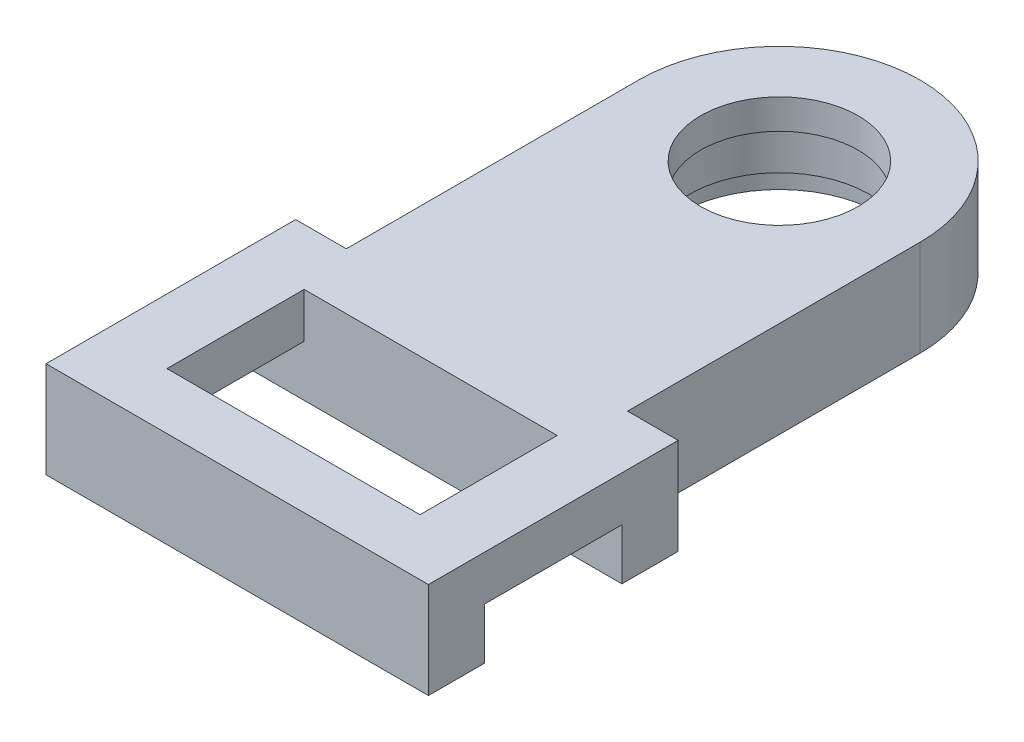
ISO-10303-21;
HEADER;
FILE_DESCRIPTION(('STEP AP214'),'2;1');
FILE_NAME('part.step','',(''),(''),'','','');
FILE_SCHEMA(('AUTOMOTIVE_DESIGN { 1 0 10303 214 1 1 1 1 }'));
ENDSEC;
DATA;
#1=APPLICATION_CONTEXT('core data for automotive mechanical design processes');
#2=APPLICATION_PROTOCOL_DEFINITION('international standard','automotive_design',2000,#1);
#3=PRODUCT_CONTEXT('',#1,'mechanical');
#4=PRODUCT('Part','Part','',(#3));
#5=PRODUCT_RELATED_PRODUCT_CATEGORY('part','',(#4));
#6=PRODUCT_DEFINITION_FORMATION('','',#4);
#7=PRODUCT_DEFINITION_CONTEXT('part definition',#1,'design');
#8=PRODUCT_DEFINITION('design','',#6,#7);
#9=PRODUCT_DEFINITION_SHAPE('','',#8);
#10=(LENGTH_UNIT() NAMED_UNIT(*) SI_UNIT(.MILLI.,.METRE.));
#11=(NAMED_UNIT(*) PLANE_ANGLE_UNIT() SI_UNIT($,.RADIAN.));
#12=(NAMED_UNIT(*) SI_UNIT($,.STERADIAN.) SOLID_ANGLE_UNIT());
#13=UNCERTAINTY_MEASURE_WITH_UNIT(LENGTH_MEASURE(1.E-05),#10,'distance_accuracy_value','');
#14=(GEOMETRIC_REPRESENTATION_CONTEXT(3) GLOBAL_UNCERTAINTY_ASSIGNED_CONTEXT((#13)) GLOBAL_UNIT_ASSIGNED_CONTEXT((#10,
#11,#12)) REPRESENTATION_CONTEXT('',''));
#15=CARTESIAN_POINT('',(0.,0.,0.));
#16=DIRECTION('',(0.,0.,1.));
#17=DIRECTION('',(1.,0.,0.));
#18=AXIS2_PLACEMENT_3D('',#15,#16,#17);
#19=CARTESIAN_POINT('',(0.,0.,-37.1));
#20=DIRECTION('',(0.,1.,0.));
#21=DIRECTION('',(0.,0.,1.));
#22=AXIS2_PLACEMENT_3D('',#19,#20,#21);
#23=CYLINDRICAL_SURFACE('',#22,8.);
#24=CARTESIAN_POINT('',(0.,-2.55,-37.1));
#25=DIRECTION('',(0.,-1.,0.));
#26=DIRECTION('',(0.,0.,-1.));
#27=AXIS2_PLACEMENT_3D('',#24,#25,#26);
#28=CIRCLE('',#27,8.);
#29=CARTESIAN_POINT('',(0.,-2.55,-45.1));
#30=VERTEX_POINT('',#29);
#31=EDGE_CURVE('E223',#30,#30,#28,.T.);
#32=ORIENTED_EDGE('',*,*,#31,.T.);
#33=EDGE_LOOP('',(#32));
#34=FACE_BOUND('',#33,.T.);
#35=CARTESIAN_POINT('',(0.,1.35,-37.1));
#36=DIRECTION('',(0.,1.,0.));
#37=DIRECTION('',(0.,0.,1.));
#38=AXIS2_PLACEMENT_3D('',#35,#36,#37);
#39=CIRCLE('',#38,8.);
#40=CARTESIAN_POINT('',(0.,1.35,-29.1));
#41=VERTEX_POINT('',#40);
#42=EDGE_CURVE('E11',#41,#41,#39,.F.);
#43=ORIENTED_EDGE('',*,*,#42,.F.);
#44=EDGE_LOOP('',(#43));
#45=FACE_BOUND('',#44,.T.);
#46=ADVANCED_FACE('F41',(#34,#45),#23,.F.);
#47=CARTESIAN_POINT('',(0.,0.,0.));
#48=DIRECTION('',(0.,-1.,0.));
#49=DIRECTION('',(0.,0.,-1.));
#50=AXIS2_PLACEMENT_3D('',#47,#48,#49);
#51=PLANE('',#50);
#52=DIRECTION('',(0.,0.,-1.));
#53=VECTOR('',#52,1.);
#54=CARTESIAN_POINT('',(17.,0.,11.1));
#55=LINE('',#54,#53);
#56=CARTESIAN_POINT('',(17.,0.,6.1));
#57=VERTEX_POINT('',#56);
#58=CARTESIAN_POINT('',(17.,0.,-6.1));
#59=VERTEX_POINT('',#58);
#60=EDGE_CURVE('E56',#57,#59,#55,.T.);
#61=ORIENTED_EDGE('',*,*,#60,.F.);
#62=DIRECTION('',(1.,0.,0.));
#63=VECTOR('',#62,1.);
#64=CARTESIAN_POINT('',(0.,0.,6.1));
#65=LINE('',#64,#63);
#66=CARTESIAN_POINT('',(11.25,0.,6.1));
#67=VERTEX_POINT('',#66);
#68=EDGE_CURVE('E179',#67,#57,#65,.T.);
#69=ORIENTED_EDGE('',*,*,#68,.F.);
#70=DIRECTION('',(0.,0.,-1.));
#71=VECTOR('',#70,1.);
#72=CARTESIAN_POINT('',(11.25,0.,6.1));
#73=LINE('',#72,#71);
#74=CARTESIAN_POINT('',(11.25,0.,-6.1));
#75=VERTEX_POINT('',#74);
#76=EDGE_CURVE('E238',#67,#75,#73,.T.);
#77=ORIENTED_EDGE('',*,*,#76,.T.);
#78=DIRECTION('',(1.,0.,0.));
#79=VECTOR('',#78,1.);
#80=CARTESIAN_POINT('',(0.,0.,-6.1));
#81=LINE('',#80,#79);
#82=EDGE_CURVE('E215',#75,#59,#81,.T.);
#83=ORIENTED_EDGE('',*,*,#82,.T.);
#84=EDGE_LOOP('',(#61,#69,#77,#83));
#85=FACE_BOUND('',#84,.T.);
#86=ADVANCED_FACE('F355',(#85),#51,.T.);
#87=DIRECTION('',(0.,0.,1.));
#88=VECTOR('',#87,1.);
#89=CARTESIAN_POINT('',(-11.25,0.,6.1));
#90=LINE('',#89,#88);
#91=CARTESIAN_POINT('',(-11.25,0.,-6.1));
#92=VERTEX_POINT('',#91);
#93=CARTESIAN_POINT('',(-11.25,0.,6.1));
#94=VERTEX_POINT('',#93);
#95=EDGE_CURVE('E248',#92,#94,#90,.T.);
#96=ORIENTED_EDGE('',*,*,#95,.T.);
#97=CARTESIAN_POINT('',(-17.,0.,6.1));
#98=VERTEX_POINT('',#97);
#99=EDGE_CURVE('E64',#98,#94,#65,.T.);
#100=ORIENTED_EDGE('',*,*,#99,.F.);
#101=DIRECTION('',(0.,0.,1.));
#102=VECTOR('',#101,1.);
#103=CARTESIAN_POINT('',(-17.,0.,11.1));
#104=LINE('',#103,#102);
#105=CARTESIAN_POINT('',(-17.,0.,-6.1));
#106=VERTEX_POINT('',#105);
#107=EDGE_CURVE('E173',#106,#98,#104,.T.);
#108=ORIENTED_EDGE('',*,*,#107,.F.);
#109=EDGE_CURVE('E190',#106,#92,#81,.T.);
#110=ORIENTED_EDGE('',*,*,#109,.T.);
#111=EDGE_LOOP('',(#96,#100,#108,#110));
#112=FACE_BOUND('',#111,.T.);
#113=ADVANCED_FACE('F352',(#112),#51,.T.);
#114=CARTESIAN_POINT('',(-17.,4.,-11.1));
#115=DIRECTION('',(0.,0.,1.));
#116=DIRECTION('',(1.,0.,0.));
#117=AXIS2_PLACEMENT_3D('',#114,#115,#116);
#118=PLANE('',#117);
#119=DIRECTION('',(0.,1.,0.));
#120=VECTOR('',#119,1.);
#121=CARTESIAN_POINT('',(-12.5,0.,-11.1));
#122=LINE('',#121,#120);
#123=CARTESIAN_POINT('',(-12.5,-4.55,-11.1));
#124=VERTEX_POINT('',#123);
#125=CARTESIAN_POINT('',(-12.5,4.,-11.1));
#126=VERTEX_POINT('',#125);
#127=EDGE_CURVE('E242',#124,#126,#122,.T.);
#128=ORIENTED_EDGE('',*,*,#127,.F.);
#129=DIRECTION('',(1.,0.,0.));
#130=VECTOR('',#129,1.);
#131=CARTESIAN_POINT('',(0.,-4.55,-11.1));
#132=LINE('',#131,#130);
#133=CARTESIAN_POINT('',(-17.,-4.55,-11.1));
#134=VERTEX_POINT('',#133);
#135=EDGE_CURVE('E193',#134,#124,#132,.T.);
#136=ORIENTED_EDGE('',*,*,#135,.F.);
#137=DIRECTION('',(0.,-1.,0.));
#138=VECTOR('',#137,1.);
#139=CARTESIAN_POINT('',(-17.,4.,-11.1));
#140=LINE('',#139,#138);
#141=CARTESIAN_POINT('',(-17.,4.,-11.1));
#142=VERTEX_POINT('',#141);
#143=EDGE_CURVE('E285',#142,#134,#140,.T.);
#144=ORIENTED_EDGE('',*,*,#143,.F.);
#145=DIRECTION('',(-1.,0.,0.));
#146=VECTOR('',#145,1.);
#147=CARTESIAN_POINT('',(-17.,4.,-11.1));
#148=LINE('',#147,#146);
#149=EDGE_CURVE('E271',#126,#142,#148,.T.);
#150=ORIENTED_EDGE('',*,*,#149,.F.);
#151=EDGE_LOOP('',(#128,#136,#144,#150));
#152=FACE_BOUND('',#151,.T.);
#153=ADVANCED_FACE('F307',(#152),#118,.F.);
#154=CARTESIAN_POINT('',(0.,4.,0.));
#155=DIRECTION('',(0.,-1.,0.));
#156=DIRECTION('',(0.,0.,-1.));
#157=AXIS2_PLACEMENT_3D('',#154,#155,#156);
#158=PLANE('',#157);
#159=DIRECTION('',(0.,0.,-1.));
#160=VECTOR('',#159,1.);
#161=CARTESIAN_POINT('',(17.,4.,11.1));
#162=LINE('',#161,#160);
#163=CARTESIAN_POINT('',(17.,4.,11.1));
#164=VERTEX_POINT('',#163);
#165=CARTESIAN_POINT('',(17.,4.,-11.1));
#166=VERTEX_POINT('',#165);
#167=EDGE_CURVE('E268',#164,#166,#162,.T.);
#168=ORIENTED_EDGE('',*,*,#167,.T.);
#169=CARTESIAN_POINT('',(12.5,4.,-11.1));
#170=VERTEX_POINT('',#169);
#171=EDGE_CURVE('E272',#166,#170,#148,.T.);
#172=ORIENTED_EDGE('',*,*,#171,.T.);
#173=DIRECTION('',(0.,0.,-1.));
#174=VECTOR('',#173,1.);
#175=CARTESIAN_POINT('',(12.5,4.,-37.1));
#176=LINE('',#175,#174);
#177=CARTESIAN_POINT('',(12.5,4.,-37.1));
#178=VERTEX_POINT('',#177);
#179=EDGE_CURVE('E232',#170,#178,#176,.T.);
#180=ORIENTED_EDGE('',*,*,#179,.T.);
#181=CARTESIAN_POINT('',(0.,4.,-37.1));
#182=DIRECTION('',(0.,1.,0.));
#183=DIRECTION('',(0.,0.,1.));
#184=AXIS2_PLACEMENT_3D('',#181,#182,#183);
#185=CIRCLE('',#184,12.5);
#186=CARTESIAN_POINT('',(-12.5,4.,-37.1));
#187=VERTEX_POINT('',#186);
#188=EDGE_CURVE('E226',#178,#187,#185,.T.);
#189=ORIENTED_EDGE('',*,*,#188,.T.);
#190=DIRECTION('',(0.,0.,1.));
#191=VECTOR('',#190,1.);
#192=CARTESIAN_POINT('',(-12.5,4.,-37.1));
#193=LINE('',#192,#191);
#194=EDGE_CURVE('E229',#187,#126,#193,.T.);
#195=ORIENTED_EDGE('',*,*,#194,.T.);
#196=ORIENTED_EDGE('',*,*,#149,.T.);
#197=DIRECTION('',(0.,0.,1.));
#198=VECTOR('',#197,1.);
#199=CARTESIAN_POINT('',(-17.,4.,11.1));
#200=LINE('',#199,#198);
#201=CARTESIAN_POINT('',(-17.,4.,11.1));
#202=VERTEX_POINT('',#201);
#203=EDGE_CURVE('E275',#142,#202,#200,.T.);
#204=ORIENTED_EDGE('',*,*,#203,.T.);
#205=DIRECTION('',(1.,0.,0.));
#206=VECTOR('',#205,1.);
#207=CARTESIAN_POINT('',(-17.,4.,11.1));
#208=LINE('',#207,#206);
#209=EDGE_CURVE('E277',#202,#164,#208,.T.);
#210=ORIENTED_EDGE('',*,*,#209,.T.);
#211=EDGE_LOOP('',(#168,#172,#180,#189,#195,#196,#204,#210));
#212=FACE_BOUND('',#211,.T.);
#213=DIRECTION('',(0.,0.,-1.));
#214=VECTOR('',#213,1.);
#215=CARTESIAN_POINT('',(11.25,4.,6.1));
#216=LINE('',#215,#214);
#217=CARTESIAN_POINT('',(11.25,4.,6.1));
#218=VERTEX_POINT('',#217);
#219=CARTESIAN_POINT('',(11.25,4.,-6.1));
#220=VERTEX_POINT('',#219);
#221=EDGE_CURVE('E245',#218,#220,#216,.T.);
#222=ORIENTED_EDGE('',*,*,#221,.F.);
#223=DIRECTION('',(1.,0.,0.));
#224=VECTOR('',#223,1.);
#225=CARTESIAN_POINT('',(-11.25,4.,6.1));
#226=LINE('',#225,#224);
#227=CARTESIAN_POINT('',(-11.25,4.,6.1));
#228=VERTEX_POINT('',#227);
#229=EDGE_CURVE('E253',#228,#218,#226,.T.);
#230=ORIENTED_EDGE('',*,*,#229,.F.);
#231=DIRECTION('',(0.,0.,1.));
#232=VECTOR('',#231,1.);
#233=CARTESIAN_POINT('',(-11.25,4.,6.1));
#234=LINE('',#233,#232);
#235=CARTESIAN_POINT('',(-11.25,4.,-6.1));
#236=VERTEX_POINT('',#235);
#237=EDGE_CURVE('E250',#236,#228,#234,.T.);
#238=ORIENTED_EDGE('',*,*,#237,.F.);
#239=DIRECTION('',(-1.,0.,0.));
#240=VECTOR('',#239,1.);
#241=CARTESIAN_POINT('',(-11.25,4.,-6.1));
#242=LINE('',#241,#240);
#243=EDGE_CURVE('E247',#220,#236,#242,.T.);
#244=ORIENTED_EDGE('',*,*,#243,.F.);
#245=EDGE_LOOP('',(#222,#230,#238,#244));
#246=FACE_BOUND('',#245,.T.);
#247=CARTESIAN_POINT('',(0.,4.,-37.1));
#248=DIRECTION('',(0.,1.,0.));
#249=DIRECTION('',(0.,0.,1.));
#250=AXIS2_PLACEMENT_3D('',#247,#248,#249);
#251=CIRCLE('',#250,7.);
#252=CARTESIAN_POINT('',(0.,4.,-30.1));
#253=VERTEX_POINT('',#252);
#254=EDGE_CURVE('E329',#253,#253,#251,.T.);
#255=ORIENTED_EDGE('',*,*,#254,.F.);
#256=EDGE_LOOP('',(#255));
#257=FACE_BOUND('',#256,.T.);
#258=ADVANCED_FACE('F314',(#212,#246,#257),#158,.F.);
#259=CARTESIAN_POINT('',(17.,4.,11.1));
#260=DIRECTION('',(-1.,0.,0.));
#261=DIRECTION('',(0.,0.,1.));
#262=AXIS2_PLACEMENT_3D('',#259,#260,#261);
#263=PLANE('',#262);
#264=DIRECTION('',(0.,-1.,0.));
#265=VECTOR('',#264,1.);
#266=CARTESIAN_POINT('',(17.,4.,11.1));
#267=LINE('',#266,#265);
#268=CARTESIAN_POINT('',(17.,-4.55,11.1));
#269=VERTEX_POINT('',#268);
#270=EDGE_CURVE('E279',#164,#269,#267,.T.);
#271=ORIENTED_EDGE('',*,*,#270,.T.);
#272=DIRECTION('',(0.,0.,1.));
#273=VECTOR('',#272,1.);
#274=CARTESIAN_POINT('',(17.,-4.55,0.));
#275=LINE('',#274,#273);
#276=CARTESIAN_POINT('',(17.,-4.55,6.1));
#277=VERTEX_POINT('',#276);
#278=EDGE_CURVE('E180',#277,#269,#275,.T.);
#279=ORIENTED_EDGE('',*,*,#278,.F.);
#280=DIRECTION('',(0.,1.,0.));
#281=VECTOR('',#280,1.);
#282=CARTESIAN_POINT('',(17.,-4.55,6.1));
#283=LINE('',#282,#281);
#284=EDGE_CURVE('E175',#277,#57,#283,.T.);
#285=ORIENTED_EDGE('',*,*,#284,.T.);
#286=ORIENTED_EDGE('',*,*,#60,.T.);
#287=DIRECTION('',(0.,1.,0.));
#288=VECTOR('',#287,1.);
#289=CARTESIAN_POINT('',(17.,-4.55,-6.1));
#290=LINE('',#289,#288);
#291=CARTESIAN_POINT('',(17.,-4.55,-6.1));
#292=VERTEX_POINT('',#291);
#293=EDGE_CURVE('E213',#292,#59,#290,.T.);
#294=ORIENTED_EDGE('',*,*,#293,.F.);
#295=DIRECTION('',(0.,0.,1.));
#296=VECTOR('',#295,1.);
#297=CARTESIAN_POINT('',(17.,-4.55,0.));
#298=LINE('',#297,#296);
#299=CARTESIAN_POINT('',(17.,-4.55,-11.1));
#300=VERTEX_POINT('',#299);
#301=EDGE_CURVE('E208',#300,#292,#298,.T.);
#302=ORIENTED_EDGE('',*,*,#301,.F.);
#303=DIRECTION('',(0.,-1.,0.));
#304=VECTOR('',#303,1.);
#305=CARTESIAN_POINT('',(17.,4.,-11.1));
#306=LINE('',#305,#304);
#307=EDGE_CURVE('E49',#166,#300,#306,.T.);
#308=ORIENTED_EDGE('',*,*,#307,.F.);
#309=ORIENTED_EDGE('',*,*,#167,.F.);
#310=EDGE_LOOP('',(#271,#279,#285,#286,#294,#302,#308,#309));
#311=FACE_BOUND('',#310,.T.);
#312=ADVANCED_FACE('F43',(#311),#263,.F.);
#313=ORIENTED_EDGE('',*,*,#307,.T.);
#314=DIRECTION('',(1.,0.,0.));
#315=VECTOR('',#314,1.);
#316=CARTESIAN_POINT('',(0.,-4.55,-11.1));
#317=LINE('',#316,#315);
#318=CARTESIAN_POINT('',(12.5,-4.55,-11.1));
#319=VERTEX_POINT('',#318);
#320=EDGE_CURVE('E205',#319,#300,#317,.T.);
#321=ORIENTED_EDGE('',*,*,#320,.F.);
#322=DIRECTION('',(0.,1.,0.));
#323=VECTOR('',#322,1.);
#324=CARTESIAN_POINT('',(12.5,0.,-11.1));
#325=LINE('',#324,#323);
#326=EDGE_CURVE('E239',#319,#170,#325,.T.);
#327=ORIENTED_EDGE('',*,*,#326,.T.);
#328=ORIENTED_EDGE('',*,*,#171,.F.);
#329=EDGE_LOOP('',(#313,#321,#327,#328));
#330=FACE_BOUND('',#329,.T.);
#331=ADVANCED_FACE('F289',(#330),#118,.F.);
#332=CARTESIAN_POINT('',(-17.,4.,11.1));
#333=DIRECTION('',(1.,0.,0.));
#334=DIRECTION('',(0.,0.,-1.));
#335=AXIS2_PLACEMENT_3D('',#332,#333,#334);
#336=PLANE('',#335);
#337=ORIENTED_EDGE('',*,*,#143,.T.);
#338=DIRECTION('',(0.,0.,-1.));
#339=VECTOR('',#338,1.);
#340=CARTESIAN_POINT('',(-17.,-4.55,0.));
#341=LINE('',#340,#339);
#342=CARTESIAN_POINT('',(-17.,-4.55,-6.1));
#343=VERTEX_POINT('',#342);
#344=EDGE_CURVE('E189',#343,#134,#341,.T.);
#345=ORIENTED_EDGE('',*,*,#344,.F.);
#346=DIRECTION('',(0.,1.,0.));
#347=VECTOR('',#346,1.);
#348=CARTESIAN_POINT('',(-17.,-4.55,-6.1));
#349=LINE('',#348,#347);
#350=EDGE_CURVE('E218',#343,#106,#349,.T.);
#351=ORIENTED_EDGE('',*,*,#350,.T.);
#352=ORIENTED_EDGE('',*,*,#107,.T.);
#353=DIRECTION('',(0.,1.,0.));
#354=VECTOR('',#353,1.);
#355=CARTESIAN_POINT('',(-17.,-4.55,6.1));
#356=LINE('',#355,#354);
#357=CARTESIAN_POINT('',(-17.,-4.55,6.1));
#358=VERTEX_POINT('',#357);
#359=EDGE_CURVE('E169',#358,#98,#356,.T.);
#360=ORIENTED_EDGE('',*,*,#359,.F.);
#361=DIRECTION('',(0.,0.,-1.));
#362=VECTOR('',#361,1.);
#363=CARTESIAN_POINT('',(-17.,-4.55,0.));
#364=LINE('',#363,#362);
#365=CARTESIAN_POINT('',(-17.,-4.55,11.1));
#366=VERTEX_POINT('',#365);
#367=EDGE_CURVE('E158',#366,#358,#364,.T.);
#368=ORIENTED_EDGE('',*,*,#367,.F.);
#369=DIRECTION('',(0.,-1.,0.));
#370=VECTOR('',#369,1.);
#371=CARTESIAN_POINT('',(-17.,4.,11.1));
#372=LINE('',#371,#370);
#373=EDGE_CURVE('E283',#202,#366,#372,.T.);
#374=ORIENTED_EDGE('',*,*,#373,.F.);
#375=ORIENTED_EDGE('',*,*,#203,.F.);
#376=EDGE_LOOP('',(#337,#345,#351,#352,#360,#368,#374,#375));
#377=FACE_BOUND('',#376,.T.);
#378=ADVANCED_FACE('F172',(#377),#336,.F.);
#379=CARTESIAN_POINT('',(-17.,4.,11.1));
#380=DIRECTION('',(0.,0.,-1.));
#381=DIRECTION('',(-1.,0.,0.));
#382=AXIS2_PLACEMENT_3D('',#379,#380,#381);
#383=PLANE('',#382);
#384=ORIENTED_EDGE('',*,*,#373,.T.);
#385=DIRECTION('',(-1.,0.,0.));
#386=VECTOR('',#385,1.);
#387=CARTESIAN_POINT('',(0.,-4.55,11.1));
#388=LINE('',#387,#386);
#389=EDGE_CURVE('E166',#269,#366,#388,.T.);
#390=ORIENTED_EDGE('',*,*,#389,.F.);
#391=ORIENTED_EDGE('',*,*,#270,.F.);
#392=ORIENTED_EDGE('',*,*,#209,.F.);
#393=EDGE_LOOP('',(#384,#390,#391,#392));
#394=FACE_BOUND('',#393,.T.);
#395=ADVANCED_FACE('F325',(#394),#383,.F.);
#396=CARTESIAN_POINT('',(11.25,4.,6.1));
#397=DIRECTION('',(-1.,0.,0.));
#398=DIRECTION('',(0.,0.,1.));
#399=AXIS2_PLACEMENT_3D('',#396,#397,#398);
#400=PLANE('',#399);
#401=ORIENTED_EDGE('',*,*,#76,.F.);
#402=DIRECTION('',(0.,-1.,0.));
#403=VECTOR('',#402,1.);
#404=CARTESIAN_POINT('',(11.25,4.,6.1));
#405=LINE('',#404,#403);
#406=EDGE_CURVE('E255',#218,#67,#405,.T.);
#407=ORIENTED_EDGE('',*,*,#406,.F.);
#408=ORIENTED_EDGE('',*,*,#221,.T.);
#409=DIRECTION('',(0.,-1.,0.));
#410=VECTOR('',#409,1.);
#411=CARTESIAN_POINT('',(11.25,4.,-6.1));
#412=LINE('',#411,#410);
#413=EDGE_CURVE('E265',#220,#75,#412,.T.);
#414=ORIENTED_EDGE('',*,*,#413,.T.);
#415=EDGE_LOOP('',(#401,#407,#408,#414));
#416=FACE_BOUND('',#415,.T.);
#417=ADVANCED_FACE('F380',(#416),#400,.T.);
#418=CARTESIAN_POINT('',(-11.25,4.,-6.1));
#419=DIRECTION('',(0.,0.,1.));
#420=DIRECTION('',(1.,0.,0.));
#421=AXIS2_PLACEMENT_3D('',#418,#419,#420);
#422=PLANE('',#421);
#423=DIRECTION('',(0.,-1.,0.));
#424=VECTOR('',#423,1.);
#425=CARTESIAN_POINT('',(-11.25,4.,-6.1));
#426=LINE('',#425,#424);
#427=EDGE_CURVE('E262',#236,#92,#426,.T.);
#428=ORIENTED_EDGE('',*,*,#427,.T.);
#429=ORIENTED_EDGE('',*,*,#109,.F.);
#430=ORIENTED_EDGE('',*,*,#350,.F.);
#431=DIRECTION('',(1.,0.,0.));
#432=VECTOR('',#431,1.);
#433=CARTESIAN_POINT('',(0.,-4.55,-6.1));
#434=LINE('',#433,#432);
#435=EDGE_CURVE('E186',#343,#292,#434,.T.);
#436=ORIENTED_EDGE('',*,*,#435,.T.);
#437=ORIENTED_EDGE('',*,*,#293,.T.);
#438=ORIENTED_EDGE('',*,*,#82,.F.);
#439=ORIENTED_EDGE('',*,*,#413,.F.);
#440=ORIENTED_EDGE('',*,*,#243,.T.);
#441=EDGE_LOOP('',(#428,#429,#430,#436,#437,#438,#439,#440));
#442=FACE_BOUND('',#441,.T.);
#443=ADVANCED_FACE('F300',(#442),#422,.T.);
#444=CARTESIAN_POINT('',(-11.25,4.,6.1));
#445=DIRECTION('',(1.,0.,0.));
#446=DIRECTION('',(0.,0.,-1.));
#447=AXIS2_PLACEMENT_3D('',#444,#445,#446);
#448=PLANE('',#447);
#449=ORIENTED_EDGE('',*,*,#95,.F.);
#450=ORIENTED_EDGE('',*,*,#427,.F.);
#451=ORIENTED_EDGE('',*,*,#237,.T.);
#452=DIRECTION('',(0.,-1.,0.));
#453=VECTOR('',#452,1.);
#454=CARTESIAN_POINT('',(-11.25,4.,6.1));
#455=LINE('',#454,#453);
#456=EDGE_CURVE('E260',#228,#94,#455,.T.);
#457=ORIENTED_EDGE('',*,*,#456,.T.);
#458=EDGE_LOOP('',(#449,#450,#451,#457));
#459=FACE_BOUND('',#458,.T.);
#460=ADVANCED_FACE('F375',(#459),#448,.T.);
#461=CARTESIAN_POINT('',(-11.25,4.,6.1));
#462=DIRECTION('',(0.,0.,-1.));
#463=DIRECTION('',(-1.,0.,0.));
#464=AXIS2_PLACEMENT_3D('',#461,#462,#463);
#465=PLANE('',#464);
#466=ORIENTED_EDGE('',*,*,#406,.T.);
#467=ORIENTED_EDGE('',*,*,#68,.T.);
#468=ORIENTED_EDGE('',*,*,#284,.F.);
#469=DIRECTION('',(1.,0.,0.));
#470=VECTOR('',#469,1.);
#471=CARTESIAN_POINT('',(0.,-4.55,6.1));
#472=LINE('',#471,#470);
#473=EDGE_CURVE('E163',#358,#277,#472,.T.);
#474=ORIENTED_EDGE('',*,*,#473,.F.);
#475=ORIENTED_EDGE('',*,*,#359,.T.);
#476=ORIENTED_EDGE('',*,*,#99,.T.);
#477=ORIENTED_EDGE('',*,*,#456,.F.);
#478=ORIENTED_EDGE('',*,*,#229,.T.);
#479=EDGE_LOOP('',(#466,#467,#468,#474,#475,#476,#477,#478));
#480=FACE_BOUND('',#479,.T.);
#481=ADVANCED_FACE('F177',(#480),#465,.T.);
#482=CARTESIAN_POINT('',(0.,0.,-37.1));
#483=DIRECTION('',(0.,1.,0.));
#484=DIRECTION('',(0.,0.,1.));
#485=AXIS2_PLACEMENT_3D('',#482,#483,#484);
#486=CYLINDRICAL_SURFACE('',#485,12.5);
#487=ORIENTED_EDGE('',*,*,#188,.F.);
#488=DIRECTION('',(0.,1.,0.));
#489=VECTOR('',#488,1.);
#490=CARTESIAN_POINT('',(12.5,0.,-37.1));
#491=LINE('',#490,#489);
#492=CARTESIAN_POINT('',(12.5,-4.55,-37.1));
#493=VERTEX_POINT('',#492);
#494=EDGE_CURVE('E236',#493,#178,#491,.T.);
#495=ORIENTED_EDGE('',*,*,#494,.F.);
#496=CARTESIAN_POINT('',(0.,-4.55,-37.1));
#497=DIRECTION('',(0.,-1.,0.));
#498=DIRECTION('',(0.,0.,-1.));
#499=AXIS2_PLACEMENT_3D('',#496,#497,#498);
#500=CIRCLE('',#499,12.5);
#501=CARTESIAN_POINT('',(-12.5,-4.55,-37.1));
#502=VERTEX_POINT('',#501);
#503=EDGE_CURVE('E199',#502,#493,#500,.T.);
#504=ORIENTED_EDGE('',*,*,#503,.F.);
#505=DIRECTION('',(0.,1.,0.));
#506=VECTOR('',#505,1.);
#507=CARTESIAN_POINT('',(-12.5,0.,-37.1));
#508=LINE('',#507,#506);
#509=EDGE_CURVE('E235',#502,#187,#508,.T.);
#510=ORIENTED_EDGE('',*,*,#509,.T.);
#511=EDGE_LOOP('',(#487,#495,#504,#510));
#512=FACE_BOUND('',#511,.T.);
#513=ADVANCED_FACE('F318',(#512),#486,.T.);
#514=CARTESIAN_POINT('',(12.5,0.,-37.1));
#515=DIRECTION('',(1.,0.,0.));
#516=DIRECTION('',(0.,0.,-1.));
#517=AXIS2_PLACEMENT_3D('',#514,#515,#516);
#518=PLANE('',#517);
#519=ORIENTED_EDGE('',*,*,#179,.F.);
#520=ORIENTED_EDGE('',*,*,#326,.F.);
#521=DIRECTION('',(0.,0.,1.));
#522=VECTOR('',#521,1.);
#523=CARTESIAN_POINT('',(12.5,-4.55,0.));
#524=LINE('',#523,#522);
#525=EDGE_CURVE('E202',#493,#319,#524,.T.);
#526=ORIENTED_EDGE('',*,*,#525,.F.);
#527=ORIENTED_EDGE('',*,*,#494,.T.);
#528=EDGE_LOOP('',(#519,#520,#526,#527));
#529=FACE_BOUND('',#528,.T.);
#530=ADVANCED_FACE('F321',(#529),#518,.T.);
#531=CARTESIAN_POINT('',(-12.5,0.,-37.1));
#532=DIRECTION('',(-1.,0.,0.));
#533=DIRECTION('',(0.,0.,1.));
#534=AXIS2_PLACEMENT_3D('',#531,#532,#533);
#535=PLANE('',#534);
#536=ORIENTED_EDGE('',*,*,#194,.F.);
#537=ORIENTED_EDGE('',*,*,#509,.F.);
#538=DIRECTION('',(0.,0.,-1.));
#539=VECTOR('',#538,1.);
#540=CARTESIAN_POINT('',(-12.5,-4.55,0.));
#541=LINE('',#540,#539);
#542=EDGE_CURVE('E196',#124,#502,#541,.T.);
#543=ORIENTED_EDGE('',*,*,#542,.F.);
#544=ORIENTED_EDGE('',*,*,#127,.T.);
#545=EDGE_LOOP('',(#536,#537,#543,#544));
#546=FACE_BOUND('',#545,.T.);
#547=ADVANCED_FACE('F312',(#546),#535,.T.);
#548=CARTESIAN_POINT('',(0.,-2.55,-37.1));
#549=DIRECTION('',(0.,-1.,0.));
#550=DIRECTION('',(0.,0.,-1.));
#551=AXIS2_PLACEMENT_3D('',#548,#549,#550);
#552=PLANE('',#551);
#553=CARTESIAN_POINT('',(0.,-2.55,-37.1));
#554=DIRECTION('',(0.,-1.,0.));
#555=DIRECTION('',(0.,0.,-1.));
#556=AXIS2_PLACEMENT_3D('',#553,#554,#555);
#557=CIRCLE('',#556,9.);
#558=CARTESIAN_POINT('',(0.,-2.55,-46.1));
#559=VERTEX_POINT('',#558);
#560=EDGE_CURVE('E220',#559,#559,#557,.T.);
#561=ORIENTED_EDGE('',*,*,#560,.T.);
#562=EDGE_LOOP('',(#561));
#563=FACE_BOUND('',#562,.T.);
#564=ORIENTED_EDGE('',*,*,#31,.F.);
#565=EDGE_LOOP('',(#564));
#566=FACE_BOUND('',#565,.T.);
#567=ADVANCED_FACE('F365',(#563,#566),#552,.T.);
#568=CARTESIAN_POINT('',(0.,-4.55,-37.1));
#569=DIRECTION('',(0.,1.,0.));
#570=DIRECTION('',(0.,0.,1.));
#571=AXIS2_PLACEMENT_3D('',#568,#569,#570);
#572=CYLINDRICAL_SURFACE('',#571,9.);
#573=ORIENTED_EDGE('',*,*,#560,.F.);
#574=EDGE_LOOP('',(#573));
#575=FACE_BOUND('',#574,.T.);
#576=CARTESIAN_POINT('',(0.,-4.55,-37.1));
#577=DIRECTION('',(0.,-1.,0.));
#578=DIRECTION('',(0.,0.,-1.));
#579=AXIS2_PLACEMENT_3D('',#576,#577,#578);
#580=CIRCLE('',#579,9.);
#581=CARTESIAN_POINT('',(0.,-4.55,-46.1));
#582=VERTEX_POINT('',#581);
#583=EDGE_CURVE('E210',#582,#582,#580,.F.);
#584=ORIENTED_EDGE('',*,*,#583,.F.);
#585=EDGE_LOOP('',(#584));
#586=FACE_BOUND('',#585,.T.);
#587=ADVANCED_FACE('F496',(#575,#586),#572,.F.);
#588=CARTESIAN_POINT('',(0.,-4.55,0.));
#589=DIRECTION('',(0.,-1.,0.));
#590=DIRECTION('',(0.,0.,-1.));
#591=AXIS2_PLACEMENT_3D('',#588,#589,#590);
#592=PLANE('',#591);
#593=ORIENTED_EDGE('',*,*,#435,.F.);
#594=ORIENTED_EDGE('',*,*,#344,.T.);
#595=ORIENTED_EDGE('',*,*,#135,.T.);
#596=ORIENTED_EDGE('',*,*,#542,.T.);
#597=ORIENTED_EDGE('',*,*,#503,.T.);
#598=ORIENTED_EDGE('',*,*,#525,.T.);
#599=ORIENTED_EDGE('',*,*,#320,.T.);
#600=ORIENTED_EDGE('',*,*,#301,.T.);
#601=EDGE_LOOP('',(#593,#594,#595,#596,#597,#598,#599,#600));
#602=FACE_BOUND('',#601,.T.);
#603=ORIENTED_EDGE('',*,*,#583,.T.);
#604=EDGE_LOOP('',(#603));
#605=FACE_BOUND('',#604,.T.);
#606=ADVANCED_FACE('F295',(#602,#605),#592,.T.);
#607=CARTESIAN_POINT('',(0.,-4.55,0.));
#608=DIRECTION('',(0.,-1.,0.));
#609=DIRECTION('',(0.,0.,-1.));
#610=AXIS2_PLACEMENT_3D('',#607,#608,#609);
#611=PLANE('',#610);
#612=ORIENTED_EDGE('',*,*,#473,.T.);
#613=ORIENTED_EDGE('',*,*,#278,.T.);
#614=ORIENTED_EDGE('',*,*,#389,.T.);
#615=ORIENTED_EDGE('',*,*,#367,.T.);
#616=EDGE_LOOP('',(#612,#613,#614,#615));
#617=FACE_BOUND('',#616,.T.);
#618=ADVANCED_FACE('F160',(#617),#611,.T.);
#619=CARTESIAN_POINT('',(0.,1.35,-37.1));
#620=DIRECTION('',(0.,1.,0.));
#621=DIRECTION('',(0.,0.,1.));
#622=AXIS2_PLACEMENT_3D('',#619,#620,#621);
#623=PLANE('',#622);
#624=CARTESIAN_POINT('',(0.,1.35,-37.1));
#625=DIRECTION('',(0.,1.,0.));
#626=DIRECTION('',(0.,0.,1.));
#627=AXIS2_PLACEMENT_3D('',#624,#625,#626);
#628=CIRCLE('',#627,7.);
#629=CARTESIAN_POINT('',(0.,1.35,-30.1));
#630=VERTEX_POINT('',#629);
#631=EDGE_CURVE('E328',#630,#630,#628,.T.);
#632=ORIENTED_EDGE('',*,*,#631,.T.);
#633=EDGE_LOOP('',(#632));
#634=FACE_BOUND('',#633,.T.);
#635=ORIENTED_EDGE('',*,*,#42,.T.);
#636=EDGE_LOOP('',(#635));
#637=FACE_BOUND('',#636,.T.);
#638=ADVANCED_FACE('F335',(#634,#637),#623,.F.);
#639=CARTESIAN_POINT('',(0.,1.35,-37.1));
#640=DIRECTION('',(0.,1.,0.));
#641=DIRECTION('',(0.,0.,1.));
#642=AXIS2_PLACEMENT_3D('',#639,#640,#641);
#643=CYLINDRICAL_SURFACE('',#642,7.);
#644=ORIENTED_EDGE('',*,*,#631,.F.);
#645=EDGE_LOOP('',(#644));
#646=FACE_BOUND('',#645,.T.);
#647=ORIENTED_EDGE('',*,*,#254,.T.);
#648=EDGE_LOOP('',(#647));
#649=FACE_BOUND('',#648,.T.);
#650=ADVANCED_FACE('F338',(#646,#649),#643,.F.);
#651=CLOSED_SHELL('',(#46,#86,#113,#153,#258,#312,#331,#378,#395,#417,#443,#460,#481,#513,#530,
#547,#567,#587,#606,#618,#638,#650));
#652=MANIFOLD_SOLID_BREP('B2',#651);
#653=ADVANCED_BREP_SHAPE_REPRESENTATION('',(#18,#652),#14);
#654=SHAPE_DEFINITION_REPRESENTATION(#9,#653);
ENDSEC;
END-ISO-10303-21;
